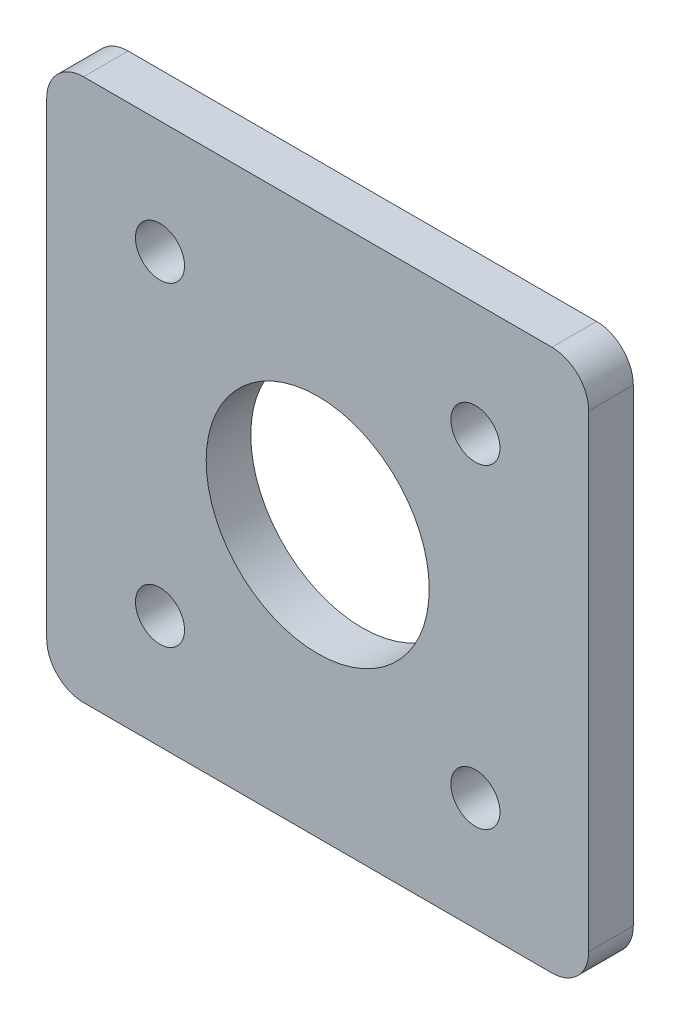
ISO-10303-21;
HEADER;
FILE_DESCRIPTION(('STEP AP214'),'2;1');
FILE_NAME('part.step','',(''),(''),'','','');
FILE_SCHEMA(('AUTOMOTIVE_DESIGN { 1 0 10303 214 1 1 1 1 }'));
ENDSEC;
DATA;
#1=APPLICATION_CONTEXT('core data for automotive mechanical design processes');
#2=APPLICATION_PROTOCOL_DEFINITION('international standard','automotive_design',2000,#1);
#3=PRODUCT_CONTEXT('',#1,'mechanical');
#4=PRODUCT('Part','Part','',(#3));
#5=PRODUCT_RELATED_PRODUCT_CATEGORY('part','',(#4));
#6=PRODUCT_DEFINITION_FORMATION('','',#4);
#7=PRODUCT_DEFINITION_CONTEXT('part definition',#1,'design');
#8=PRODUCT_DEFINITION('design','',#6,#7);
#9=PRODUCT_DEFINITION_SHAPE('','',#8);
#10=(LENGTH_UNIT() NAMED_UNIT(*) SI_UNIT(.MILLI.,.METRE.));
#11=(NAMED_UNIT(*) PLANE_ANGLE_UNIT() SI_UNIT($,.RADIAN.));
#12=(NAMED_UNIT(*) SI_UNIT($,.STERADIAN.) SOLID_ANGLE_UNIT());
#13=UNCERTAINTY_MEASURE_WITH_UNIT(LENGTH_MEASURE(1.E-05),#10,'distance_accuracy_value','');
#14=(GEOMETRIC_REPRESENTATION_CONTEXT(3) GLOBAL_UNCERTAINTY_ASSIGNED_CONTEXT((#13)) GLOBAL_UNIT_ASSIGNED_CONTEXT((#10,
#11,#12)) REPRESENTATION_CONTEXT('',''));
#15=CARTESIAN_POINT('',(0.,0.,0.));
#16=DIRECTION('',(0.,0.,1.));
#17=DIRECTION('',(1.,0.,0.));
#18=AXIS2_PLACEMENT_3D('',#15,#16,#17);
#19=CARTESIAN_POINT('',(-16.5432189845748,-0.988325298672384,2.));
#20=DIRECTION('',(0.,0.,1.));
#21=DIRECTION('',(1.,0.,0.));
#22=AXIS2_PLACEMENT_3D('',#19,#20,#21);
#23=PLANE('',#22);
#24=CARTESIAN_POINT('',(-13.1142867964402,-4.41725748680701,2.));
#25=DIRECTION('',(0.,0.,1.));
#26=DIRECTION('',(1.,0.,0.));
#27=AXIS2_PLACEMENT_3D('',#24,#25,#26);
#28=CIRCLE('',#27,1.1);
#29=CARTESIAN_POINT('',(-12.0142867964402,-4.41725748680701,2.));
#30=VERTEX_POINT('',#29);
#31=EDGE_CURVE('E148',#30,#30,#28,.T.);
#32=ORIENTED_EDGE('',*,*,#31,.F.);
#33=EDGE_LOOP('',(#32));
#34=FACE_BOUND('',#33,.T.);
#35=CARTESIAN_POINT('',(1.02784882729082,-18.5593931105379,2.));
#36=DIRECTION('',(0.,0.,1.));
#37=DIRECTION('',(1.,0.,0.));
#38=AXIS2_PLACEMENT_3D('',#35,#36,#37);
#39=CIRCLE('',#38,1.1);
#40=CARTESIAN_POINT('',(2.12784882729082,-18.5593931105379,2.));
#41=VERTEX_POINT('',#40);
#42=EDGE_CURVE('E162',#41,#41,#39,.T.);
#43=ORIENTED_EDGE('',*,*,#42,.F.);
#44=EDGE_LOOP('',(#43));
#45=FACE_BOUND('',#44,.T.);
#46=CARTESIAN_POINT('',(1.02784882729071,-4.41725748680696,2.));
#47=DIRECTION('',(0.,0.,1.));
#48=DIRECTION('',(1.,0.,0.));
#49=AXIS2_PLACEMENT_3D('',#46,#47,#48);
#50=CIRCLE('',#49,1.1);
#51=CARTESIAN_POINT('',(2.12784882729071,-4.41725748680696,2.));
#52=VERTEX_POINT('',#51);
#53=EDGE_CURVE('E11',#52,#52,#50,.T.);
#54=ORIENTED_EDGE('',*,*,#53,.F.);
#55=EDGE_LOOP('',(#54));
#56=FACE_BOUND('',#55,.T.);
#57=CARTESIAN_POINT('',(-13.1142867964402,-18.559393110538,2.));
#58=DIRECTION('',(0.,0.,1.));
#59=DIRECTION('',(1.,0.,0.));
#60=AXIS2_PLACEMENT_3D('',#57,#58,#59);
#61=CIRCLE('',#60,1.1);
#62=CARTESIAN_POINT('',(-12.0142867964402,-18.559393110538,2.));
#63=VERTEX_POINT('',#62);
#64=EDGE_CURVE('E168',#63,#63,#61,.T.);
#65=ORIENTED_EDGE('',*,*,#64,.F.);
#66=EDGE_LOOP('',(#65));
#67=FACE_BOUND('',#66,.T.);
#68=CARTESIAN_POINT('',(-6.0432189845748,-11.4883252986724,2.));
#69=DIRECTION('',(0.,0.,1.));
#70=DIRECTION('',(1.,0.,0.));
#71=AXIS2_PLACEMENT_3D('',#68,#69,#70);
#72=CIRCLE('',#71,5.);
#73=CARTESIAN_POINT('',(-1.0432189845748,-11.4883252986724,2.));
#74=VERTEX_POINT('',#73);
#75=EDGE_CURVE('E156',#74,#74,#72,.T.);
#76=ORIENTED_EDGE('',*,*,#75,.F.);
#77=EDGE_LOOP('',(#76));
#78=FACE_BOUND('',#77,.T.);
#79=CARTESIAN_POINT('',(-16.5432189845748,-0.988325298672384,2.));
#80=DIRECTION('',(0.,0.,1.));
#81=DIRECTION('',(1.,0.,0.));
#82=AXIS2_PLACEMENT_3D('',#79,#80,#81);
#83=CIRCLE('',#82,1.65);
#84=CARTESIAN_POINT('',(-16.5432189845748,0.661674701327616,2.));
#85=VERTEX_POINT('',#84);
#86=CARTESIAN_POINT('',(-18.1932189845748,-0.988325298672384,2.));
#87=VERTEX_POINT('',#86);
#88=EDGE_CURVE('E118',#85,#87,#83,.T.);
#89=ORIENTED_EDGE('',*,*,#88,.T.);
#90=DIRECTION('',(0.,-1.,0.));
#91=VECTOR('',#90,1.);
#92=CARTESIAN_POINT('',(-18.1932189845748,-0.988325298672384,2.));
#93=LINE('',#92,#91);
#94=CARTESIAN_POINT('',(-18.1932189845748,-21.9883252986724,2.));
#95=VERTEX_POINT('',#94);
#96=EDGE_CURVE('E48',#87,#95,#93,.T.);
#97=ORIENTED_EDGE('',*,*,#96,.T.);
#98=CARTESIAN_POINT('',(-16.5432189845748,-21.9883252986724,2.));
#99=DIRECTION('',(0.,0.,1.));
#100=DIRECTION('',(1.,0.,0.));
#101=AXIS2_PLACEMENT_3D('',#98,#99,#100);
#102=CIRCLE('',#101,1.65);
#103=CARTESIAN_POINT('',(-16.5432189845748,-23.6383252986724,2.));
#104=VERTEX_POINT('',#103);
#105=EDGE_CURVE('E108',#95,#104,#102,.T.);
#106=ORIENTED_EDGE('',*,*,#105,.T.);
#107=DIRECTION('',(1.,0.,0.));
#108=VECTOR('',#107,1.);
#109=CARTESIAN_POINT('',(-16.5432189845748,-23.6383252986724,2.));
#110=LINE('',#109,#108);
#111=CARTESIAN_POINT('',(4.45678101542519,-23.6383252986724,2.));
#112=VERTEX_POINT('',#111);
#113=EDGE_CURVE('E114',#104,#112,#110,.T.);
#114=ORIENTED_EDGE('',*,*,#113,.T.);
#115=CARTESIAN_POINT('',(4.45678101542519,-21.9883252986724,2.));
#116=DIRECTION('',(0.,0.,1.));
#117=DIRECTION('',(1.,0.,0.));
#118=AXIS2_PLACEMENT_3D('',#115,#116,#117);
#119=CIRCLE('',#118,1.65);
#120=CARTESIAN_POINT('',(6.10678101542519,-21.9883252986724,2.));
#121=VERTEX_POINT('',#120);
#122=EDGE_CURVE('E124',#112,#121,#119,.T.);
#123=ORIENTED_EDGE('',*,*,#122,.T.);
#124=DIRECTION('',(0.,1.,0.));
#125=VECTOR('',#124,1.);
#126=CARTESIAN_POINT('',(6.10678101542519,-21.9883252986724,2.));
#127=LINE('',#126,#125);
#128=CARTESIAN_POINT('',(6.10678101542519,-0.988325298672384,2.));
#129=VERTEX_POINT('',#128);
#130=EDGE_CURVE('E127',#121,#129,#127,.T.);
#131=ORIENTED_EDGE('',*,*,#130,.T.);
#132=CARTESIAN_POINT('',(4.45678101542519,-0.988325298672384,2.));
#133=DIRECTION('',(0.,0.,1.));
#134=DIRECTION('',(1.,0.,0.));
#135=AXIS2_PLACEMENT_3D('',#132,#133,#134);
#136=CIRCLE('',#135,1.65);
#137=CARTESIAN_POINT('',(4.45678101542519,0.661674701327618,2.));
#138=VERTEX_POINT('',#137);
#139=EDGE_CURVE('E130',#129,#138,#136,.T.);
#140=ORIENTED_EDGE('',*,*,#139,.T.);
#141=DIRECTION('',(-1.,0.,0.));
#142=VECTOR('',#141,1.);
#143=CARTESIAN_POINT('',(4.45678101542519,0.661674701327618,2.));
#144=LINE('',#143,#142);
#145=EDGE_CURVE('E133',#138,#85,#144,.T.);
#146=ORIENTED_EDGE('',*,*,#145,.T.);
#147=EDGE_LOOP('',(#89,#97,#106,#114,#123,#131,#140,#146));
#148=FACE_BOUND('',#147,.T.);
#149=ADVANCED_FACE('F33',(#34,#45,#56,#67,#78,#148),#23,.T.);
#150=CARTESIAN_POINT('',(-16.5432189845748,-0.988325298672384,0.));
#151=DIRECTION('',(0.,0.,1.));
#152=DIRECTION('',(1.,0.,0.));
#153=AXIS2_PLACEMENT_3D('',#150,#151,#152);
#154=PLANE('',#153);
#155=CARTESIAN_POINT('',(-13.1142867964402,-4.41725748680701,0.));
#156=DIRECTION('',(0.,0.,1.));
#157=DIRECTION('',(1.,0.,0.));
#158=AXIS2_PLACEMENT_3D('',#155,#156,#157);
#159=CIRCLE('',#158,1.1);
#160=CARTESIAN_POINT('',(-12.0142867964402,-4.41725748680701,0.));
#161=VERTEX_POINT('',#160);
#162=EDGE_CURVE('E152',#161,#161,#159,.T.);
#163=ORIENTED_EDGE('',*,*,#162,.T.);
#164=EDGE_LOOP('',(#163));
#165=FACE_BOUND('',#164,.T.);
#166=CARTESIAN_POINT('',(-6.0432189845748,-11.4883252986724,0.));
#167=DIRECTION('',(0.,0.,1.));
#168=DIRECTION('',(1.,0.,0.));
#169=AXIS2_PLACEMENT_3D('',#166,#167,#168);
#170=CIRCLE('',#169,5.);
#171=CARTESIAN_POINT('',(-1.0432189845748,-11.4883252986724,0.));
#172=VERTEX_POINT('',#171);
#173=EDGE_CURVE('E151',#172,#172,#170,.T.);
#174=ORIENTED_EDGE('',*,*,#173,.T.);
#175=EDGE_LOOP('',(#174));
#176=FACE_BOUND('',#175,.T.);
#177=CARTESIAN_POINT('',(1.02784882729082,-18.5593931105379,0.));
#178=DIRECTION('',(0.,0.,1.));
#179=DIRECTION('',(1.,0.,0.));
#180=AXIS2_PLACEMENT_3D('',#177,#178,#179);
#181=CIRCLE('',#180,1.1);
#182=CARTESIAN_POINT('',(2.12784882729082,-18.5593931105379,0.));
#183=VERTEX_POINT('',#182);
#184=EDGE_CURVE('E159',#183,#183,#181,.T.);
#185=ORIENTED_EDGE('',*,*,#184,.T.);
#186=EDGE_LOOP('',(#185));
#187=FACE_BOUND('',#186,.T.);
#188=CARTESIAN_POINT('',(-13.1142867964402,-18.559393110538,0.));
#189=DIRECTION('',(0.,0.,1.));
#190=DIRECTION('',(1.,0.,0.));
#191=AXIS2_PLACEMENT_3D('',#188,#189,#190);
#192=CIRCLE('',#191,1.1);
#193=CARTESIAN_POINT('',(-12.0142867964402,-18.559393110538,0.));
#194=VERTEX_POINT('',#193);
#195=EDGE_CURVE('E165',#194,#194,#192,.T.);
#196=ORIENTED_EDGE('',*,*,#195,.T.);
#197=EDGE_LOOP('',(#196));
#198=FACE_BOUND('',#197,.T.);
#199=CARTESIAN_POINT('',(1.02784882729071,-4.41725748680696,0.));
#200=DIRECTION('',(0.,0.,1.));
#201=DIRECTION('',(1.,0.,0.));
#202=AXIS2_PLACEMENT_3D('',#199,#200,#201);
#203=CIRCLE('',#202,1.1);
#204=CARTESIAN_POINT('',(2.12784882729071,-4.41725748680696,0.));
#205=VERTEX_POINT('',#204);
#206=EDGE_CURVE('E37',#205,#205,#203,.T.);
#207=ORIENTED_EDGE('',*,*,#206,.T.);
#208=EDGE_LOOP('',(#207));
#209=FACE_BOUND('',#208,.T.);
#210=DIRECTION('',(0.,1.,0.));
#211=VECTOR('',#210,1.);
#212=CARTESIAN_POINT('',(-18.1932189845748,-0.988325298672384,0.));
#213=LINE('',#212,#211);
#214=CARTESIAN_POINT('',(-18.1932189845748,-21.9883252986724,0.));
#215=VERTEX_POINT('',#214);
#216=CARTESIAN_POINT('',(-18.1932189845748,-0.988325298672384,0.));
#217=VERTEX_POINT('',#216);
#218=EDGE_CURVE('E101',#215,#217,#213,.T.);
#219=ORIENTED_EDGE('',*,*,#218,.T.);
#220=CARTESIAN_POINT('',(-16.5432189845748,-0.988325298672384,0.));
#221=DIRECTION('',(0.,0.,1.));
#222=DIRECTION('',(1.,0.,0.));
#223=AXIS2_PLACEMENT_3D('',#220,#221,#222);
#224=CIRCLE('',#223,1.65);
#225=CARTESIAN_POINT('',(-16.5432189845748,0.661674701327616,0.));
#226=VERTEX_POINT('',#225);
#227=EDGE_CURVE('E147',#217,#226,#224,.F.);
#228=ORIENTED_EDGE('',*,*,#227,.T.);
#229=DIRECTION('',(1.,0.,0.));
#230=VECTOR('',#229,1.);
#231=CARTESIAN_POINT('',(4.45678101542519,0.661674701327618,0.));
#232=LINE('',#231,#230);
#233=CARTESIAN_POINT('',(4.45678101542519,0.661674701327619,0.));
#234=VERTEX_POINT('',#233);
#235=EDGE_CURVE('E253',#226,#234,#232,.T.);
#236=ORIENTED_EDGE('',*,*,#235,.T.);
#237=CARTESIAN_POINT('',(4.45678101542519,-0.988325298672384,0.));
#238=DIRECTION('',(0.,0.,1.));
#239=DIRECTION('',(1.,0.,0.));
#240=AXIS2_PLACEMENT_3D('',#237,#238,#239);
#241=CIRCLE('',#240,1.65);
#242=CARTESIAN_POINT('',(6.10678101542519,-0.988325298672384,0.));
#243=VERTEX_POINT('',#242);
#244=EDGE_CURVE('E259',#234,#243,#241,.F.);
#245=ORIENTED_EDGE('',*,*,#244,.T.);
#246=DIRECTION('',(0.,-1.,0.));
#247=VECTOR('',#246,1.);
#248=CARTESIAN_POINT('',(6.10678101542519,-21.9883252986724,0.));
#249=LINE('',#248,#247);
#250=CARTESIAN_POINT('',(6.10678101542519,-21.9883252986724,0.));
#251=VERTEX_POINT('',#250);
#252=EDGE_CURVE('E263',#243,#251,#249,.T.);
#253=ORIENTED_EDGE('',*,*,#252,.T.);
#254=CARTESIAN_POINT('',(4.45678101542519,-21.9883252986724,0.));
#255=DIRECTION('',(0.,0.,1.));
#256=DIRECTION('',(1.,0.,0.));
#257=AXIS2_PLACEMENT_3D('',#254,#255,#256);
#258=CIRCLE('',#257,1.65);
#259=CARTESIAN_POINT('',(4.45678101542519,-23.6383252986724,0.));
#260=VERTEX_POINT('',#259);
#261=EDGE_CURVE('E267',#251,#260,#258,.F.);
#262=ORIENTED_EDGE('',*,*,#261,.T.);
#263=DIRECTION('',(-1.,0.,0.));
#264=VECTOR('',#263,1.);
#265=CARTESIAN_POINT('',(-16.5432189845748,-23.6383252986724,0.));
#266=LINE('',#265,#264);
#267=CARTESIAN_POINT('',(-16.5432189845748,-23.6383252986724,0.));
#268=VERTEX_POINT('',#267);
#269=EDGE_CURVE('E270',#260,#268,#266,.T.);
#270=ORIENTED_EDGE('',*,*,#269,.T.);
#271=CARTESIAN_POINT('',(-16.5432189845748,-21.9883252986724,0.));
#272=DIRECTION('',(0.,0.,1.));
#273=DIRECTION('',(1.,0.,0.));
#274=AXIS2_PLACEMENT_3D('',#271,#272,#273);
#275=CIRCLE('',#274,1.65);
#276=EDGE_CURVE('E155',#268,#215,#275,.F.);
#277=ORIENTED_EDGE('',*,*,#276,.T.);
#278=EDGE_LOOP('',(#219,#228,#236,#245,#253,#262,#270,#277));
#279=FACE_BOUND('',#278,.T.);
#280=ADVANCED_FACE('F35',(#165,#176,#187,#198,#209,#279),#154,.F.);
#281=CARTESIAN_POINT('',(1.02784882729071,-4.41725748680696,2.));
#282=DIRECTION('',(0.,0.,-1.));
#283=DIRECTION('',(-1.,0.,0.));
#284=AXIS2_PLACEMENT_3D('',#281,#282,#283);
#285=CYLINDRICAL_SURFACE('',#284,1.1);
#286=ORIENTED_EDGE('',*,*,#53,.T.);
#287=EDGE_LOOP('',(#286));
#288=FACE_BOUND('',#287,.T.);
#289=ORIENTED_EDGE('',*,*,#206,.F.);
#290=EDGE_LOOP('',(#289));
#291=FACE_BOUND('',#290,.T.);
#292=ADVANCED_FACE('F179',(#288,#291),#285,.F.);
#293=CARTESIAN_POINT('',(-13.1142867964402,-18.559393110538,2.));
#294=DIRECTION('',(0.,0.,-1.));
#295=DIRECTION('',(-1.,0.,0.));
#296=AXIS2_PLACEMENT_3D('',#293,#294,#295);
#297=CYLINDRICAL_SURFACE('',#296,1.1);
#298=ORIENTED_EDGE('',*,*,#64,.T.);
#299=EDGE_LOOP('',(#298));
#300=FACE_BOUND('',#299,.T.);
#301=ORIENTED_EDGE('',*,*,#195,.F.);
#302=EDGE_LOOP('',(#301));
#303=FACE_BOUND('',#302,.T.);
#304=ADVANCED_FACE('F176',(#300,#303),#297,.F.);
#305=CARTESIAN_POINT('',(1.02784882729082,-18.5593931105379,2.));
#306=DIRECTION('',(0.,0.,-1.));
#307=DIRECTION('',(-1.,0.,0.));
#308=AXIS2_PLACEMENT_3D('',#305,#306,#307);
#309=CYLINDRICAL_SURFACE('',#308,1.1);
#310=ORIENTED_EDGE('',*,*,#42,.T.);
#311=EDGE_LOOP('',(#310));
#312=FACE_BOUND('',#311,.T.);
#313=ORIENTED_EDGE('',*,*,#184,.F.);
#314=EDGE_LOOP('',(#313));
#315=FACE_BOUND('',#314,.T.);
#316=ADVANCED_FACE('F178',(#312,#315),#309,.F.);
#317=CARTESIAN_POINT('',(-6.0432189845748,-11.4883252986724,2.));
#318=DIRECTION('',(0.,0.,-1.));
#319=DIRECTION('',(-1.,0.,0.));
#320=AXIS2_PLACEMENT_3D('',#317,#318,#319);
#321=CYLINDRICAL_SURFACE('',#320,5.);
#322=ORIENTED_EDGE('',*,*,#75,.T.);
#323=EDGE_LOOP('',(#322));
#324=FACE_BOUND('',#323,.T.);
#325=ORIENTED_EDGE('',*,*,#173,.F.);
#326=EDGE_LOOP('',(#325));
#327=FACE_BOUND('',#326,.T.);
#328=ADVANCED_FACE('F186',(#324,#327),#321,.F.);
#329=CARTESIAN_POINT('',(-13.1142867964402,-4.41725748680701,2.));
#330=DIRECTION('',(0.,0.,-1.));
#331=DIRECTION('',(-1.,0.,0.));
#332=AXIS2_PLACEMENT_3D('',#329,#330,#331);
#333=CYLINDRICAL_SURFACE('',#332,1.1);
#334=ORIENTED_EDGE('',*,*,#31,.T.);
#335=EDGE_LOOP('',(#334));
#336=FACE_BOUND('',#335,.T.);
#337=ORIENTED_EDGE('',*,*,#162,.F.);
#338=EDGE_LOOP('',(#337));
#339=FACE_BOUND('',#338,.T.);
#340=ADVANCED_FACE('F209',(#336,#339),#333,.F.);
#341=CARTESIAN_POINT('',(-18.1932189845748,-0.988325298672384,-35.3553390593274));
#342=DIRECTION('',(-1.,0.,0.));
#343=DIRECTION('',(0.,0.,1.));
#344=AXIS2_PLACEMENT_3D('',#341,#342,#343);
#345=PLANE('',#344);
#346=DIRECTION('',(0.,0.,1.));
#347=VECTOR('',#346,1.);
#348=CARTESIAN_POINT('',(-18.1932189845748,-21.9883252986724,-35.3553390593274));
#349=LINE('',#348,#347);
#350=EDGE_CURVE('E97',#215,#95,#349,.T.);
#351=ORIENTED_EDGE('',*,*,#350,.T.);
#352=ORIENTED_EDGE('',*,*,#96,.F.);
#353=DIRECTION('',(0.,0.,1.));
#354=VECTOR('',#353,1.);
#355=CARTESIAN_POINT('',(-18.1932189845748,-0.988325298672384,-35.3553390593274));
#356=LINE('',#355,#354);
#357=EDGE_CURVE('E105',#217,#87,#356,.T.);
#358=ORIENTED_EDGE('',*,*,#357,.F.);
#359=ORIENTED_EDGE('',*,*,#218,.F.);
#360=EDGE_LOOP('',(#351,#352,#358,#359));
#361=FACE_BOUND('',#360,.T.);
#362=ADVANCED_FACE('F99',(#361),#345,.T.);
#363=CARTESIAN_POINT('',(-16.5432189845748,-21.9883252986724,-35.3553390593274));
#364=DIRECTION('',(0.,0.,1.));
#365=DIRECTION('',(1.,0.,0.));
#366=AXIS2_PLACEMENT_3D('',#363,#364,#365);
#367=CYLINDRICAL_SURFACE('',#366,1.65);
#368=DIRECTION('',(0.,0.,1.));
#369=VECTOR('',#368,1.);
#370=CARTESIAN_POINT('',(-16.5432189845748,-23.6383252986724,-35.3553390593274));
#371=LINE('',#370,#369);
#372=EDGE_CURVE('E104',#268,#104,#371,.T.);
#373=ORIENTED_EDGE('',*,*,#372,.T.);
#374=ORIENTED_EDGE('',*,*,#105,.F.);
#375=ORIENTED_EDGE('',*,*,#350,.F.);
#376=ORIENTED_EDGE('',*,*,#276,.F.);
#377=EDGE_LOOP('',(#373,#374,#375,#376));
#378=FACE_BOUND('',#377,.T.);
#379=ADVANCED_FACE('F109',(#378),#367,.T.);
#380=CARTESIAN_POINT('',(-16.5432189845748,-23.6383252986724,-35.3553390593274));
#381=DIRECTION('',(0.,-1.,0.));
#382=DIRECTION('',(1.,0.,0.));
#383=AXIS2_PLACEMENT_3D('',#380,#381,#382);
#384=PLANE('',#383);
#385=DIRECTION('',(0.,0.,1.));
#386=VECTOR('',#385,1.);
#387=CARTESIAN_POINT('',(4.45678101542519,-23.6383252986724,-35.3553390593274));
#388=LINE('',#387,#386);
#389=EDGE_CURVE('E142',#260,#112,#388,.T.);
#390=ORIENTED_EDGE('',*,*,#389,.T.);
#391=ORIENTED_EDGE('',*,*,#113,.F.);
#392=ORIENTED_EDGE('',*,*,#372,.F.);
#393=ORIENTED_EDGE('',*,*,#269,.F.);
#394=EDGE_LOOP('',(#390,#391,#392,#393));
#395=FACE_BOUND('',#394,.T.);
#396=ADVANCED_FACE('F230',(#395),#384,.T.);
#397=CARTESIAN_POINT('',(4.45678101542519,-21.9883252986724,-35.3553390593274));
#398=DIRECTION('',(0.,0.,1.));
#399=DIRECTION('',(1.,0.,0.));
#400=AXIS2_PLACEMENT_3D('',#397,#398,#399);
#401=CYLINDRICAL_SURFACE('',#400,1.65);
#402=DIRECTION('',(0.,0.,1.));
#403=VECTOR('',#402,1.);
#404=CARTESIAN_POINT('',(6.10678101542519,-21.9883252986724,-35.3553390593274));
#405=LINE('',#404,#403);
#406=EDGE_CURVE('E140',#251,#121,#405,.T.);
#407=ORIENTED_EDGE('',*,*,#406,.T.);
#408=ORIENTED_EDGE('',*,*,#122,.F.);
#409=ORIENTED_EDGE('',*,*,#389,.F.);
#410=ORIENTED_EDGE('',*,*,#261,.F.);
#411=EDGE_LOOP('',(#407,#408,#409,#410));
#412=FACE_BOUND('',#411,.T.);
#413=ADVANCED_FACE('F233',(#412),#401,.T.);
#414=CARTESIAN_POINT('',(6.10678101542519,-21.9883252986724,-35.3553390593274));
#415=DIRECTION('',(1.,0.,0.));
#416=DIRECTION('',(0.,0.,-1.));
#417=AXIS2_PLACEMENT_3D('',#414,#415,#416);
#418=PLANE('',#417);
#419=DIRECTION('',(0.,0.,1.));
#420=VECTOR('',#419,1.);
#421=CARTESIAN_POINT('',(6.10678101542519,-0.988325298672384,-35.3553390593274));
#422=LINE('',#421,#420);
#423=EDGE_CURVE('E138',#243,#129,#422,.T.);
#424=ORIENTED_EDGE('',*,*,#423,.T.);
#425=ORIENTED_EDGE('',*,*,#130,.F.);
#426=ORIENTED_EDGE('',*,*,#406,.F.);
#427=ORIENTED_EDGE('',*,*,#252,.F.);
#428=EDGE_LOOP('',(#424,#425,#426,#427));
#429=FACE_BOUND('',#428,.T.);
#430=ADVANCED_FACE('F237',(#429),#418,.T.);
#431=CARTESIAN_POINT('',(4.45678101542519,-0.988325298672384,-35.3553390593274));
#432=DIRECTION('',(0.,0.,1.));
#433=DIRECTION('',(1.,0.,0.));
#434=AXIS2_PLACEMENT_3D('',#431,#432,#433);
#435=CYLINDRICAL_SURFACE('',#434,1.65);
#436=DIRECTION('',(0.,0.,1.));
#437=VECTOR('',#436,1.);
#438=CARTESIAN_POINT('',(4.45678101542519,0.661674701327618,-35.3553390593274));
#439=LINE('',#438,#437);
#440=EDGE_CURVE('E136',#234,#138,#439,.T.);
#441=ORIENTED_EDGE('',*,*,#440,.T.);
#442=ORIENTED_EDGE('',*,*,#139,.F.);
#443=ORIENTED_EDGE('',*,*,#423,.F.);
#444=ORIENTED_EDGE('',*,*,#244,.F.);
#445=EDGE_LOOP('',(#441,#442,#443,#444));
#446=FACE_BOUND('',#445,.T.);
#447=ADVANCED_FACE('F241',(#446),#435,.T.);
#448=CARTESIAN_POINT('',(4.45678101542519,0.661674701327618,-35.3553390593274));
#449=DIRECTION('',(0.,1.,0.));
#450=DIRECTION('',(-1.,0.,0.));
#451=AXIS2_PLACEMENT_3D('',#448,#449,#450);
#452=PLANE('',#451);
#453=DIRECTION('',(0.,0.,1.));
#454=VECTOR('',#453,1.);
#455=CARTESIAN_POINT('',(-16.5432189845748,0.661674701327616,-35.3553390593274));
#456=LINE('',#455,#454);
#457=EDGE_CURVE('E56',#226,#85,#456,.T.);
#458=ORIENTED_EDGE('',*,*,#457,.T.);
#459=ORIENTED_EDGE('',*,*,#145,.F.);
#460=ORIENTED_EDGE('',*,*,#440,.F.);
#461=ORIENTED_EDGE('',*,*,#235,.F.);
#462=EDGE_LOOP('',(#458,#459,#460,#461));
#463=FACE_BOUND('',#462,.T.);
#464=ADVANCED_FACE('F225',(#463),#452,.T.);
#465=CARTESIAN_POINT('',(-16.5432189845748,-0.988325298672384,-35.3553390593274));
#466=DIRECTION('',(0.,0.,1.));
#467=DIRECTION('',(1.,0.,0.));
#468=AXIS2_PLACEMENT_3D('',#465,#466,#467);
#469=CYLINDRICAL_SURFACE('',#468,1.65);
#470=ORIENTED_EDGE('',*,*,#357,.T.);
#471=ORIENTED_EDGE('',*,*,#88,.F.);
#472=ORIENTED_EDGE('',*,*,#457,.F.);
#473=ORIENTED_EDGE('',*,*,#227,.F.);
#474=EDGE_LOOP('',(#470,#471,#472,#473));
#475=FACE_BOUND('',#474,.T.);
#476=ADVANCED_FACE('F222',(#475),#469,.T.);
#477=CLOSED_SHELL('',(#149,#280,#292,#304,#316,#328,#340,#362,#379,#396,#413,#430,#447,#464,#476));
#478=MANIFOLD_SOLID_BREP('B2',#477);
#479=ADVANCED_BREP_SHAPE_REPRESENTATION('',(#18,#478),#14);
#480=SHAPE_DEFINITION_REPRESENTATION(#9,#479);
ENDSEC;
END-ISO-10303-21;
